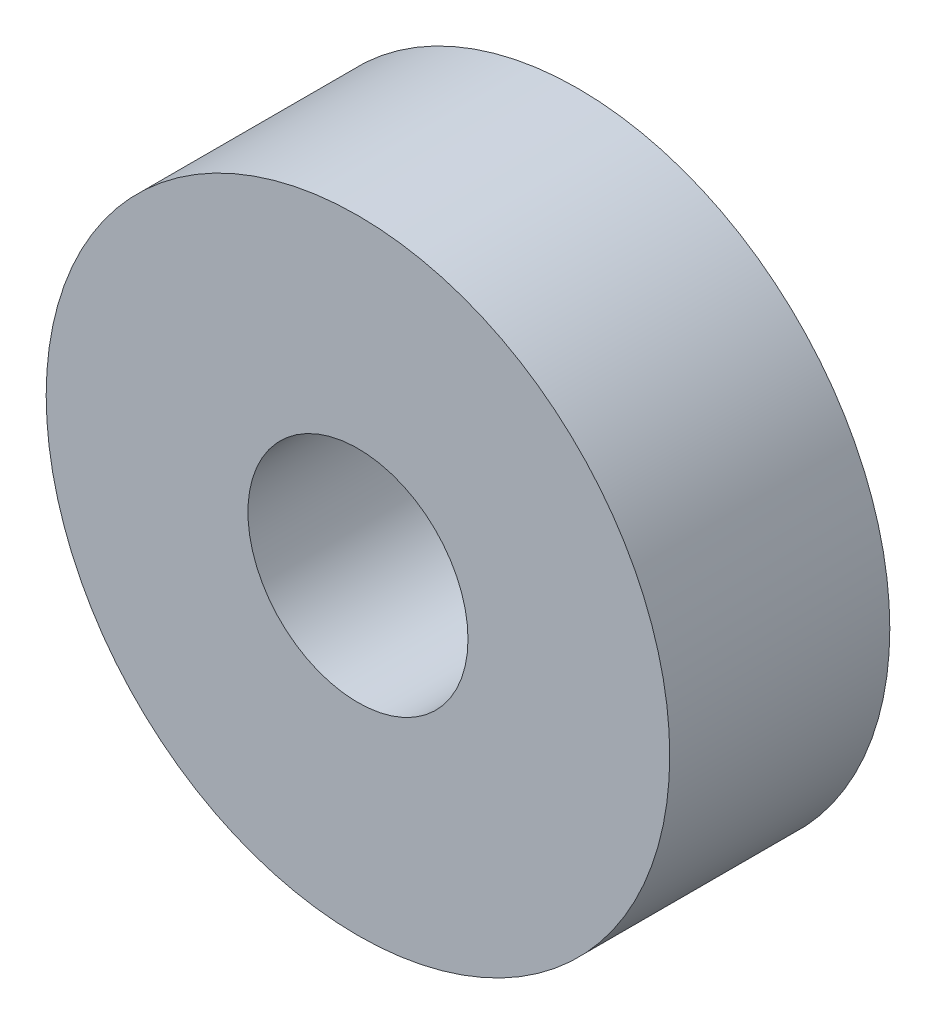
ISO-10303-21;
HEADER;
FILE_DESCRIPTION(('STEP AP214'),'2;1');
FILE_NAME('part.step','',(''),(''),'','','');
FILE_SCHEMA(('AUTOMOTIVE_DESIGN { 1 0 10303 214 1 1 1 1 }'));
ENDSEC;
DATA;
#1=APPLICATION_CONTEXT('core data for automotive mechanical design processes');
#2=APPLICATION_PROTOCOL_DEFINITION('international standard','automotive_design',2000,#1);
#3=PRODUCT_CONTEXT('',#1,'mechanical');
#4=PRODUCT('Part','Part','',(#3));
#5=PRODUCT_RELATED_PRODUCT_CATEGORY('part','',(#4));
#6=PRODUCT_DEFINITION_FORMATION('','',#4);
#7=PRODUCT_DEFINITION_CONTEXT('part definition',#1,'design');
#8=PRODUCT_DEFINITION('design','',#6,#7);
#9=PRODUCT_DEFINITION_SHAPE('','',#8);
#10=(LENGTH_UNIT() NAMED_UNIT(*) SI_UNIT(.MILLI.,.METRE.));
#11=(NAMED_UNIT(*) PLANE_ANGLE_UNIT() SI_UNIT($,.RADIAN.));
#12=(NAMED_UNIT(*) SI_UNIT($,.STERADIAN.) SOLID_ANGLE_UNIT());
#13=UNCERTAINTY_MEASURE_WITH_UNIT(LENGTH_MEASURE(1.E-05),#10,'distance_accuracy_value','');
#14=(GEOMETRIC_REPRESENTATION_CONTEXT(3) GLOBAL_UNCERTAINTY_ASSIGNED_CONTEXT((#13)) GLOBAL_UNIT_ASSIGNED_CONTEXT((#10,
#11,#12)) REPRESENTATION_CONTEXT('',''));
#15=CARTESIAN_POINT('',(0.,0.,0.));
#16=DIRECTION('',(0.,0.,1.));
#17=DIRECTION('',(1.,0.,0.));
#18=AXIS2_PLACEMENT_3D('',#15,#16,#17);
#19=CARTESIAN_POINT('',(0.,0.,6.));
#20=DIRECTION('',(0.,0.,-1.));
#21=DIRECTION('',(-1.,0.,0.));
#22=AXIS2_PLACEMENT_3D('',#19,#20,#21);
#23=CYLINDRICAL_SURFACE('',#22,8.5);
#24=CARTESIAN_POINT('',(0.,0.,6.));
#25=DIRECTION('',(0.,0.,1.));
#26=DIRECTION('',(1.,0.,0.));
#27=AXIS2_PLACEMENT_3D('',#24,#25,#26);
#28=CIRCLE('',#27,8.5);
#29=CARTESIAN_POINT('',(8.5,0.,6.));
#30=VERTEX_POINT('',#29);
#31=EDGE_CURVE('E10',#30,#30,#28,.T.);
#32=ORIENTED_EDGE('',*,*,#31,.F.);
#33=EDGE_LOOP('',(#32));
#34=FACE_BOUND('',#33,.T.);
#35=CARTESIAN_POINT('',(0.,0.,0.));
#36=DIRECTION('',(0.,0.,1.));
#37=DIRECTION('',(1.,0.,0.));
#38=AXIS2_PLACEMENT_3D('',#35,#36,#37);
#39=CIRCLE('',#38,8.5);
#40=CARTESIAN_POINT('',(8.5,0.,0.));
#41=VERTEX_POINT('',#40);
#42=EDGE_CURVE('E46',#41,#41,#39,.T.);
#43=ORIENTED_EDGE('',*,*,#42,.T.);
#44=EDGE_LOOP('',(#43));
#45=FACE_BOUND('',#44,.T.);
#46=ADVANCED_FACE('F43',(#34,#45),#23,.T.);
#47=CARTESIAN_POINT('',(0.,0.,6.));
#48=DIRECTION('',(0.,0.,1.));
#49=DIRECTION('',(1.,0.,0.));
#50=AXIS2_PLACEMENT_3D('',#47,#48,#49);
#51=PLANE('',#50);
#52=CARTESIAN_POINT('',(0.,0.,6.));
#53=DIRECTION('',(0.,0.,1.));
#54=DIRECTION('',(1.,0.,0.));
#55=AXIS2_PLACEMENT_3D('',#52,#53,#54);
#56=CIRCLE('',#55,3.);
#57=CARTESIAN_POINT('',(3.,0.,6.));
#58=VERTEX_POINT('',#57);
#59=EDGE_CURVE('E57',#58,#58,#56,.T.);
#60=ORIENTED_EDGE('',*,*,#59,.F.);
#61=EDGE_LOOP('',(#60));
#62=FACE_BOUND('',#61,.T.);
#63=ORIENTED_EDGE('',*,*,#31,.T.);
#64=EDGE_LOOP('',(#63));
#65=FACE_BOUND('',#64,.T.);
#66=ADVANCED_FACE('F74',(#62,#65),#51,.T.);
#67=CARTESIAN_POINT('',(0.,0.,0.));
#68=DIRECTION('',(0.,0.,1.));
#69=DIRECTION('',(1.,0.,0.));
#70=AXIS2_PLACEMENT_3D('',#67,#68,#69);
#71=PLANE('',#70);
#72=CARTESIAN_POINT('',(0.,0.,0.));
#73=DIRECTION('',(0.,0.,1.));
#74=DIRECTION('',(1.,0.,0.));
#75=AXIS2_PLACEMENT_3D('',#72,#73,#74);
#76=CIRCLE('',#75,3.);
#77=CARTESIAN_POINT('',(3.,0.,0.));
#78=VERTEX_POINT('',#77);
#79=EDGE_CURVE('E55',#78,#78,#76,.T.);
#80=ORIENTED_EDGE('',*,*,#79,.T.);
#81=EDGE_LOOP('',(#80));
#82=FACE_BOUND('',#81,.T.);
#83=ORIENTED_EDGE('',*,*,#42,.F.);
#84=EDGE_LOOP('',(#83));
#85=FACE_BOUND('',#84,.T.);
#86=ADVANCED_FACE('F65',(#82,#85),#71,.F.);
#87=CARTESIAN_POINT('',(0.,0.,0.));
#88=DIRECTION('',(0.,0.,1.));
#89=DIRECTION('',(1.,0.,0.));
#90=AXIS2_PLACEMENT_3D('',#87,#88,#89);
#91=CYLINDRICAL_SURFACE('',#90,3.);
#92=ORIENTED_EDGE('',*,*,#79,.F.);
#93=EDGE_LOOP('',(#92));
#94=FACE_BOUND('',#93,.T.);
#95=ORIENTED_EDGE('',*,*,#59,.T.);
#96=EDGE_LOOP('',(#95));
#97=FACE_BOUND('',#96,.T.);
#98=ADVANCED_FACE('F68',(#94,#97),#91,.F.);
#99=CLOSED_SHELL('',(#46,#66,#86,#98));
#100=MANIFOLD_SOLID_BREP('B2',#99);
#101=ADVANCED_BREP_SHAPE_REPRESENTATION('',(#18,#100),#14);
#102=SHAPE_DEFINITION_REPRESENTATION(#9,#101);
ENDSEC;
END-ISO-10303-21;
